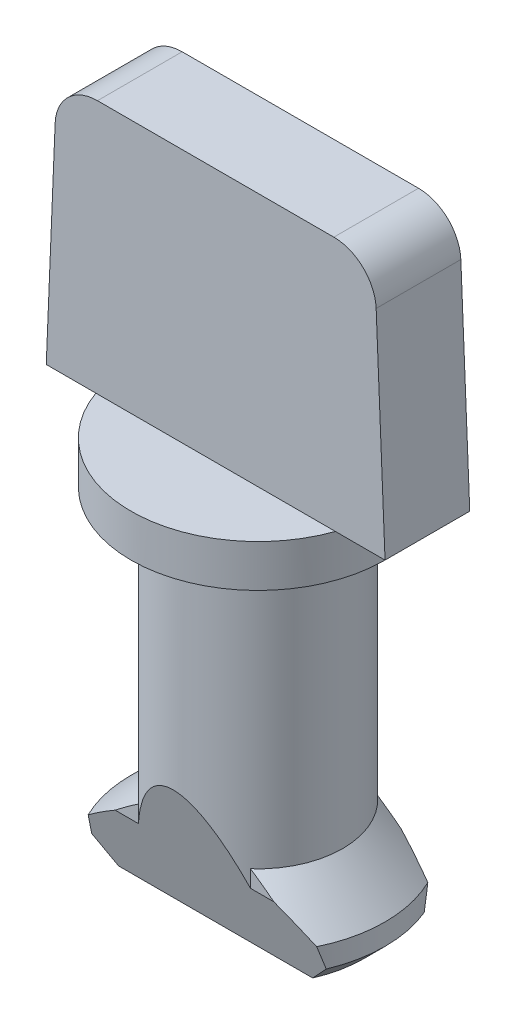
ISO-10303-21;
HEADER;
FILE_DESCRIPTION(('STEP AP214'),'2;1');
FILE_NAME('part.step','',(''),(''),'','','');
FILE_SCHEMA(('AUTOMOTIVE_DESIGN { 1 0 10303 214 1 1 1 1 }'));
ENDSEC;
DATA;
#1=APPLICATION_CONTEXT('core data for automotive mechanical design processes');
#2=APPLICATION_PROTOCOL_DEFINITION('international standard','automotive_design',2000,#1);
#3=PRODUCT_CONTEXT('',#1,'mechanical');
#4=PRODUCT('Part','Part','',(#3));
#5=PRODUCT_RELATED_PRODUCT_CATEGORY('part','',(#4));
#6=PRODUCT_DEFINITION_FORMATION('','',#4);
#7=PRODUCT_DEFINITION_CONTEXT('part definition',#1,'design');
#8=PRODUCT_DEFINITION('design','',#6,#7);
#9=PRODUCT_DEFINITION_SHAPE('','',#8);
#10=(LENGTH_UNIT() NAMED_UNIT(*) SI_UNIT(.MILLI.,.METRE.));
#11=(NAMED_UNIT(*) PLANE_ANGLE_UNIT() SI_UNIT($,.RADIAN.));
#12=(NAMED_UNIT(*) SI_UNIT($,.STERADIAN.) SOLID_ANGLE_UNIT());
#13=UNCERTAINTY_MEASURE_WITH_UNIT(LENGTH_MEASURE(1.E-05),#10,'distance_accuracy_value','');
#14=(GEOMETRIC_REPRESENTATION_CONTEXT(3) GLOBAL_UNCERTAINTY_ASSIGNED_CONTEXT((#13)) GLOBAL_UNIT_ASSIGNED_CONTEXT((#10,
#11,#12)) REPRESENTATION_CONTEXT('',''));
#15=CARTESIAN_POINT('',(0.,0.,0.));
#16=DIRECTION('',(0.,0.,1.));
#17=DIRECTION('',(1.,0.,0.));
#18=AXIS2_PLACEMENT_3D('',#15,#16,#17);
#19=CARTESIAN_POINT('',(0.,-8.4,0.));
#20=DIRECTION('',(0.,1.,0.));
#21=DIRECTION('',(0.,0.,1.));
#22=AXIS2_PLACEMENT_3D('',#19,#20,#21);
#23=CYLINDRICAL_SURFACE('',#22,2.);
#24=CARTESIAN_POINT('',(0.,0.,0.));
#25=DIRECTION('',(0.,1.,0.));
#26=DIRECTION('',(0.,0.,1.));
#27=AXIS2_PLACEMENT_3D('',#24,#25,#26);
#28=CIRCLE('',#27,2.);
#29=CARTESIAN_POINT('',(0.,0.,2.));
#30=VERTEX_POINT('',#29);
#31=EDGE_CURVE('E441',#30,#30,#28,.F.);
#32=ORIENTED_EDGE('',*,*,#31,.T.);
#33=EDGE_LOOP('',(#32));
#34=FACE_BOUND('',#33,.T.);
#35=CARTESIAN_POINT('',(0.,-11.6,0.));
#36=DIRECTION('',(0.,-0.298274993135947,-0.95447997803503));
#37=DIRECTION('',(0.,0.95447997803503,-0.298274993135947));
#38=AXIS2_PLACEMENT_3D('',#35,#36,#37);
#39=ELLIPSE('',#38,6.70522184569609,2.);
#40=CARTESIAN_POINT('',(1.32287565553229,-6.8,-1.5));
#41=VERTEX_POINT('',#40);
#42=CARTESIAN_POINT('',(-1.32287565553229,-6.8,-1.5));
#43=VERTEX_POINT('',#42);
#44=EDGE_CURVE('E54',#41,#43,#39,.F.);
#45=ORIENTED_EDGE('',*,*,#44,.T.);
#46=DIRECTION('',(0.,1.,0.));
#47=VECTOR('',#46,1.);
#48=CARTESIAN_POINT('',(-1.32287565553229,-8.4,-1.5));
#49=LINE('',#48,#47);
#50=CARTESIAN_POINT('',(-1.32287565553229,-6.4,-1.5));
#51=VERTEX_POINT('',#50);
#52=EDGE_CURVE('E372',#43,#51,#49,.T.);
#53=ORIENTED_EDGE('',*,*,#52,.T.);
#54=CARTESIAN_POINT('',(0.,-6.4,0.));
#55=DIRECTION('',(0.,-1.,0.));
#56=DIRECTION('',(0.,0.,-1.));
#57=AXIS2_PLACEMENT_3D('',#54,#55,#56);
#58=CIRCLE('',#57,2.);
#59=CARTESIAN_POINT('',(-1.3228756555323,-6.4,1.5));
#60=VERTEX_POINT('',#59);
#61=EDGE_CURVE('E206',#60,#51,#58,.T.);
#62=ORIENTED_EDGE('',*,*,#61,.F.);
#63=DIRECTION('',(0.,1.,0.));
#64=VECTOR('',#63,1.);
#65=CARTESIAN_POINT('',(-1.3228756555323,-8.4,1.5));
#66=LINE('',#65,#64);
#67=CARTESIAN_POINT('',(-1.3228756555323,-6.8,1.5));
#68=VERTEX_POINT('',#67);
#69=EDGE_CURVE('E374',#60,#68,#66,.F.);
#70=ORIENTED_EDGE('',*,*,#69,.T.);
#71=CARTESIAN_POINT('',(0.,-11.6,0.));
#72=DIRECTION('',(0.,-0.298274993135947,0.95447997803503));
#73=DIRECTION('',(0.,0.95447997803503,0.298274993135947));
#74=AXIS2_PLACEMENT_3D('',#71,#72,#73);
#75=ELLIPSE('',#74,6.70522184569609,2.);
#76=CARTESIAN_POINT('',(1.3228756555323,-6.8,1.5));
#77=VERTEX_POINT('',#76);
#78=EDGE_CURVE('E447',#68,#77,#75,.F.);
#79=ORIENTED_EDGE('',*,*,#78,.T.);
#80=DIRECTION('',(0.,1.,0.));
#81=VECTOR('',#80,1.);
#82=CARTESIAN_POINT('',(1.3228756555323,-8.4,1.5));
#83=LINE('',#82,#81);
#84=CARTESIAN_POINT('',(1.3228756555323,-6.4,1.5));
#85=VERTEX_POINT('',#84);
#86=EDGE_CURVE('E377',#77,#85,#83,.T.);
#87=ORIENTED_EDGE('',*,*,#86,.T.);
#88=CARTESIAN_POINT('',(1.32287565553229,-6.4,-1.5));
#89=VERTEX_POINT('',#88);
#90=EDGE_CURVE('E201',#89,#85,#58,.T.);
#91=ORIENTED_EDGE('',*,*,#90,.F.);
#92=DIRECTION('',(0.,1.,0.));
#93=VECTOR('',#92,1.);
#94=CARTESIAN_POINT('',(1.32287565553229,-8.4,-1.5));
#95=LINE('',#94,#93);
#96=EDGE_CURVE('E318',#89,#41,#95,.F.);
#97=ORIENTED_EDGE('',*,*,#96,.T.);
#98=EDGE_LOOP('',(#45,#53,#62,#70,#79,#87,#91,#97));
#99=FACE_BOUND('',#98,.T.);
#100=ADVANCED_FACE('F34',(#34,#99),#23,.T.);
#101=CARTESIAN_POINT('',(0.,-8.4,0.));
#102=DIRECTION('',(0.,-1.,0.));
#103=DIRECTION('',(0.,0.,-1.));
#104=AXIS2_PLACEMENT_3D('',#101,#102,#103);
#105=PLANE('',#104);
#106=CARTESIAN_POINT('',(0.,-8.4,0.));
#107=DIRECTION('',(0.,-1.,0.));
#108=DIRECTION('',(0.,0.,-1.));
#109=AXIS2_PLACEMENT_3D('',#106,#107,#108);
#110=CIRCLE('',#109,2.5);
#111=CARTESIAN_POINT('',(-2.29128784747792,-8.4,1.));
#112=VERTEX_POINT('',#111);
#113=CARTESIAN_POINT('',(-2.29128784747792,-8.4,-1.));
#114=VERTEX_POINT('',#113);
#115=EDGE_CURVE('E192',#112,#114,#110,.T.);
#116=ORIENTED_EDGE('',*,*,#115,.T.);
#117=DIRECTION('',(-1.,0.,0.));
#118=VECTOR('',#117,1.);
#119=CARTESIAN_POINT('',(4.001,-8.4,-1.));
#120=LINE('',#119,#118);
#121=CARTESIAN_POINT('',(2.29128784747792,-8.4,-1.));
#122=VERTEX_POINT('',#121);
#123=EDGE_CURVE('E174',#122,#114,#120,.T.);
#124=ORIENTED_EDGE('',*,*,#123,.F.);
#125=CARTESIAN_POINT('',(0.,-8.4,0.));
#126=DIRECTION('',(0.,-1.,0.));
#127=DIRECTION('',(0.,0.,-1.));
#128=AXIS2_PLACEMENT_3D('',#125,#126,#127);
#129=CIRCLE('',#128,2.5);
#130=CARTESIAN_POINT('',(2.29128784747792,-8.4,1.));
#131=VERTEX_POINT('',#130);
#132=EDGE_CURVE('E200',#122,#131,#129,.T.);
#133=ORIENTED_EDGE('',*,*,#132,.T.);
#134=DIRECTION('',(-1.,0.,0.));
#135=VECTOR('',#134,1.);
#136=CARTESIAN_POINT('',(4.001,-8.4,1.));
#137=LINE('',#136,#135);
#138=EDGE_CURVE('E199',#131,#112,#137,.T.);
#139=ORIENTED_EDGE('',*,*,#138,.T.);
#140=EDGE_LOOP('',(#116,#124,#133,#139));
#141=FACE_BOUND('',#140,.T.);
#142=ADVANCED_FACE('F197',(#141),#105,.T.);
#143=CARTESIAN_POINT('',(0.,-6.4,0.));
#144=DIRECTION('',(0.,-1.,0.));
#145=DIRECTION('',(0.,0.,-1.));
#146=AXIS2_PLACEMENT_3D('',#143,#144,#145);
#147=CYLINDRICAL_SURFACE('',#146,3.);
#148=CARTESIAN_POINT('',(0.,-7.40000000000001,0.));
#149=DIRECTION('',(0.,-1.,0.));
#150=DIRECTION('',(0.,0.,-1.));
#151=AXIS2_PLACEMENT_3D('',#148,#149,#150);
#152=CIRCLE('',#151,3.);
#153=CARTESIAN_POINT('',(-2.6976552318634,-7.40000000000001,1.3125));
#154=VERTEX_POINT('',#153);
#155=CARTESIAN_POINT('',(-2.6976552318634,-7.40000000000001,-1.3125));
#156=VERTEX_POINT('',#155);
#157=EDGE_CURVE('E310',#154,#156,#152,.T.);
#158=ORIENTED_EDGE('',*,*,#157,.T.);
#159=CARTESIAN_POINT('',(0.,-11.6,0.));
#160=DIRECTION('',(0.,0.298274993135947,0.95447997803503));
#161=DIRECTION('',(0.,-0.95447997803503,0.298274993135947));
#162=AXIS2_PLACEMENT_3D('',#159,#160,#161);
#163=ELLIPSE('',#162,10.0578327685441,3.);
#164=CARTESIAN_POINT('',(-2.76822794175263,-7.9,-1.15625));
#165=VERTEX_POINT('',#164);
#166=EDGE_CURVE('E194',#156,#165,#163,.T.);
#167=ORIENTED_EDGE('',*,*,#166,.T.);
#168=CARTESIAN_POINT('',(0.,-7.9,0.));
#169=DIRECTION('',(0.,-1.,0.));
#170=DIRECTION('',(0.,0.,-1.));
#171=AXIS2_PLACEMENT_3D('',#168,#169,#170);
#172=CIRCLE('',#171,3.);
#173=CARTESIAN_POINT('',(-2.76822794175263,-7.9,1.15625));
#174=VERTEX_POINT('',#173);
#175=EDGE_CURVE('E193',#165,#174,#172,.F.);
#176=ORIENTED_EDGE('',*,*,#175,.T.);
#177=CARTESIAN_POINT('',(0.,-11.6,0.));
#178=DIRECTION('',(0.,0.298274993135947,-0.95447997803503));
#179=DIRECTION('',(0.,-0.95447997803503,-0.298274993135947));
#180=AXIS2_PLACEMENT_3D('',#177,#178,#179);
#181=ELLIPSE('',#180,10.0578327685441,3.);
#182=EDGE_CURVE('E474',#174,#154,#181,.T.);
#183=ORIENTED_EDGE('',*,*,#182,.T.);
#184=EDGE_LOOP('',(#158,#167,#176,#183));
#185=FACE_BOUND('',#184,.T.);
#186=ADVANCED_FACE('F297',(#185),#147,.T.);
#187=CARTESIAN_POINT('',(0.,-6.4,0.));
#188=DIRECTION('',(0.,-1.,0.));
#189=DIRECTION('',(0.,0.,-1.));
#190=AXIS2_PLACEMENT_3D('',#187,#188,#189);
#191=CYLINDRICAL_SURFACE('',#190,3.);
#192=CARTESIAN_POINT('',(0.,-7.9,0.));
#193=DIRECTION('',(0.,-1.,0.));
#194=DIRECTION('',(0.,0.,-1.));
#195=AXIS2_PLACEMENT_3D('',#192,#193,#194);
#196=CIRCLE('',#195,3.);
#197=CARTESIAN_POINT('',(2.76822794175263,-7.9,1.15625));
#198=VERTEX_POINT('',#197);
#199=CARTESIAN_POINT('',(2.76822794175263,-7.9,-1.15625));
#200=VERTEX_POINT('',#199);
#201=EDGE_CURVE('E203',#198,#200,#196,.F.);
#202=ORIENTED_EDGE('',*,*,#201,.T.);
#203=CARTESIAN_POINT('',(0.,-11.6,0.));
#204=DIRECTION('',(0.,-0.298274993135947,-0.95447997803503));
#205=DIRECTION('',(0.,-0.95447997803503,0.298274993135947));
#206=AXIS2_PLACEMENT_3D('',#203,#204,#205);
#207=ELLIPSE('',#206,10.0578327685441,3.);
#208=CARTESIAN_POINT('',(2.6976552318634,-7.40000000000001,-1.3125));
#209=VERTEX_POINT('',#208);
#210=EDGE_CURVE('E325',#209,#200,#207,.T.);
#211=ORIENTED_EDGE('',*,*,#210,.F.);
#212=CARTESIAN_POINT('',(0.,-7.40000000000001,0.));
#213=DIRECTION('',(0.,-1.,0.));
#214=DIRECTION('',(0.,0.,-1.));
#215=AXIS2_PLACEMENT_3D('',#212,#213,#214);
#216=CIRCLE('',#215,3.);
#217=CARTESIAN_POINT('',(2.6976552318634,-7.40000000000001,1.3125));
#218=VERTEX_POINT('',#217);
#219=EDGE_CURVE('E213',#209,#218,#216,.T.);
#220=ORIENTED_EDGE('',*,*,#219,.T.);
#221=CARTESIAN_POINT('',(0.,-11.6,0.));
#222=DIRECTION('',(0.,-0.298274993135947,0.95447997803503));
#223=DIRECTION('',(0.,-0.95447997803503,-0.298274993135947));
#224=AXIS2_PLACEMENT_3D('',#221,#222,#223);
#225=ELLIPSE('',#224,10.0578327685441,3.);
#226=EDGE_CURVE('E379',#198,#218,#225,.T.);
#227=ORIENTED_EDGE('',*,*,#226,.F.);
#228=EDGE_LOOP('',(#202,#211,#220,#227));
#229=FACE_BOUND('',#228,.T.);
#230=ADVANCED_FACE('F242',(#229),#191,.T.);
#231=CARTESIAN_POINT('',(0.,-8.4,0.));
#232=DIRECTION('',(0.,1.,0.));
#233=DIRECTION('',(0.,0.,1.));
#234=AXIS2_PLACEMENT_3D('',#231,#232,#233);
#235=CONICAL_SURFACE('',#234,2.5,0.785398163397445);
#236=ORIENTED_EDGE('',*,*,#132,.F.);
#237=CARTESIAN_POINT('',(2.76841858149084,-7.8998,-1.1563125));
#238=CARTESIAN_POINT('',(2.68889899167645,-7.98322956567684,-1.13024076072599));
#239=CARTESIAN_POINT('',(2.60936239067763,-8.0666443483715,-1.10417364113391));
#240=CARTESIAN_POINT('',(2.45025516576241,-8.23344434837168,-1.05204864113385));
#241=CARTESIAN_POINT('',(2.37068454184578,-8.31682956567699,-1.02599076072594));
#242=CARTESIAN_POINT('',(2.29109690674448,-8.40019999999992,-0.999937500000026));
#243=B_SPLINE_CURVE_WITH_KNOTS('',3,(#237,#238,#239,#240,#241,#242),.UNSPECIFIED.,.F.,.F.,(4,2,
4),(0.,0.354502925726211,0.709005853897474),.UNSPECIFIED.);
#244=EDGE_CURVE('E180',#200,#122,#243,.T.);
#245=ORIENTED_EDGE('',*,*,#244,.F.);
#246=ORIENTED_EDGE('',*,*,#201,.F.);
#247=CARTESIAN_POINT('',(2.29109690674448,-8.40019999999992,0.999937500000026));
#248=CARTESIAN_POINT('',(2.37068454184578,-8.31682956567699,1.02599076072594));
#249=CARTESIAN_POINT('',(2.45025516576241,-8.23344434837168,1.05204864113385));
#250=CARTESIAN_POINT('',(2.60936239067763,-8.0666443483715,1.10417364113391));
#251=CARTESIAN_POINT('',(2.68889899167645,-7.98322956567684,1.13024076072599));
#252=CARTESIAN_POINT('',(2.76841858149084,-7.8998,1.1563125));
#253=B_SPLINE_CURVE_WITH_KNOTS('',3,(#247,#248,#249,#250,#251,#252),.UNSPECIFIED.,.F.,.F.,(4,2,
4),(0.,0.354502928171264,0.709005853897474),.UNSPECIFIED.);
#254=EDGE_CURVE('E468',#131,#198,#253,.T.);
#255=ORIENTED_EDGE('',*,*,#254,.F.);
#256=EDGE_LOOP('',(#236,#245,#246,#255));
#257=FACE_BOUND('',#256,.T.);
#258=ADVANCED_FACE('F239',(#257),#235,.T.);
#259=CARTESIAN_POINT('',(0.,-8.4,0.));
#260=DIRECTION('',(0.,1.,0.));
#261=DIRECTION('',(0.,0.,1.));
#262=AXIS2_PLACEMENT_3D('',#259,#260,#261);
#263=CONICAL_SURFACE('',#262,2.5,0.785398163397445);
#264=ORIENTED_EDGE('',*,*,#175,.F.);
#265=CARTESIAN_POINT('',(-2.76841858149084,-7.8998,-1.1563125));
#266=CARTESIAN_POINT('',(-2.68889899167644,-7.98322956567685,-1.13024076072598));
#267=CARTESIAN_POINT('',(-2.6093623906776,-8.06664434837153,-1.1041736411339));
#268=CARTESIAN_POINT('',(-2.45025516576236,-8.23344434837173,-1.05204864113383));
#269=CARTESIAN_POINT('',(-2.37068454184571,-8.31682956567706,-1.02599076072592));
#270=CARTESIAN_POINT('',(-2.2910969067444,-8.4002,-0.9999375));
#271=B_SPLINE_CURVE_WITH_KNOTS('',3,(#265,#266,#267,#268,#269,#270),.UNSPECIFIED.,.F.,.F.,(4,2,
4),(0.,0.354502925726269,0.709005853897592),.UNSPECIFIED.);
#272=EDGE_CURVE('E177',#165,#114,#271,.T.);
#273=ORIENTED_EDGE('',*,*,#272,.T.);
#274=ORIENTED_EDGE('',*,*,#115,.F.);
#275=CARTESIAN_POINT('',(-2.2910969067444,-8.4002,0.9999375));
#276=CARTESIAN_POINT('',(-2.37068454184571,-8.31682956567706,1.02599076072592));
#277=CARTESIAN_POINT('',(-2.45025516576236,-8.23344434837173,1.05204864113383));
#278=CARTESIAN_POINT('',(-2.6093623906776,-8.06664434837153,1.1041736411339));
#279=CARTESIAN_POINT('',(-2.68889899167644,-7.98322956567685,1.13024076072598));
#280=CARTESIAN_POINT('',(-2.76841858149084,-7.8998,1.1563125));
#281=B_SPLINE_CURVE_WITH_KNOTS('',3,(#275,#276,#277,#278,#279,#280),.UNSPECIFIED.,.F.,.F.,(4,2,
4),(0.,0.354502928171324,0.709005853897592),.UNSPECIFIED.);
#282=EDGE_CURVE('E327',#112,#174,#281,.T.);
#283=ORIENTED_EDGE('',*,*,#282,.T.);
#284=EDGE_LOOP('',(#264,#273,#274,#283));
#285=FACE_BOUND('',#284,.T.);
#286=ADVANCED_FACE('F190',(#285),#263,.T.);
#287=CARTESIAN_POINT('',(0.,-7.40000000000001,0.));
#288=DIRECTION('',(0.,-1.,0.));
#289=DIRECTION('',(0.,0.,-1.));
#290=AXIS2_PLACEMENT_3D('',#287,#288,#289);
#291=CONICAL_SURFACE('',#290,3.,0.78539816339745);
#292=ORIENTED_EDGE('',*,*,#219,.F.);
#293=CARTESIAN_POINT('',(1.87251925747105,-6.79936,-1.5002));
#294=CARTESIAN_POINT('',(1.94396375249612,-6.84602449107282,-1.48561734653975));
#295=CARTESIAN_POINT('',(2.01461624770995,-6.89377203946956,-1.47069623766576));
#296=CARTESIAN_POINT('',(2.15450474216702,-6.99105296639402,-1.44029594800187));
#297=CARTESIAN_POINT('',(2.22374145857821,-7.04058540379669,-1.42481706131354));
#298=CARTESIAN_POINT('',(2.36102860329289,-7.14109691534921,-1.39340721395337));
#299=CARTESIAN_POINT('',(2.42907922230267,-7.19207575341083,-1.37747632705912));
#300=CARTESIAN_POINT('',(2.56419932059313,-7.29527370373339,-1.34522696758332));
#301=CARTESIAN_POINT('',(2.63126827296004,-7.34749344525601,-1.3289082983575));
#302=CARTESIAN_POINT('',(2.69790805043347,-7.40020000000001,-1.3124375));
#303=B_SPLINE_CURVE_WITH_KNOTS('',3,(#293,#294,#295,#296,#297,#298,#299,#300,#301,#302),
.UNSPECIFIED.,.F.,.F.,(4,2,2,2,4),(0.,0.259683704644583,0.519232432836738,0.778739037272773,
1.03838017070004),.UNSPECIFIED.);
#304=CARTESIAN_POINT('',(1.87349939951959,-6.80000000000005,-1.49999999999998));
#305=VERTEX_POINT('',#304);
#306=EDGE_CURVE('E184',#305,#209,#303,.T.);
#307=ORIENTED_EDGE('',*,*,#306,.F.);
#308=CARTESIAN_POINT('',(1.32287565553228,-6.4,-1.5));
#309=CARTESIAN_POINT('',(1.37927780634971,-6.43733009722094,-1.5));
#310=CARTESIAN_POINT('',(1.4350746037007,-6.4755544852038,-1.5));
#311=CARTESIAN_POINT('',(1.54562391618774,-6.55346001850828,-1.5));
#312=CARTESIAN_POINT('',(1.60037667643987,-6.59314081533693,-1.5));
#313=CARTESIAN_POINT('',(1.70898069254342,-6.67360813443487,-1.5));
#314=CARTESIAN_POINT('',(1.76283273605452,-6.71439359904855,-1.5));
#315=CARTESIAN_POINT('',(1.86982608787185,-6.79689180204332,-1.5));
#316=CARTESIAN_POINT('',(1.92296734799838,-6.83860460277784,-1.5));
#317=CARTESIAN_POINT('',(2.081432912337,-6.96481248213767,-1.5));
#318=CARTESIAN_POINT('',(2.18586566547732,-7.05042711859945,-1.5));
#319=CARTESIAN_POINT('',(2.3412699999935,-7.18042270232268,-1.5));
#320=CARTESIAN_POINT('',(2.39288833200145,-7.22403804046788,-1.5));
#321=CARTESIAN_POINT('',(2.49574934324268,-7.31170762331325,-1.5));
#322=CARTESIAN_POINT('',(2.54699202981894,-7.35576185939409,-1.5));
#323=CARTESIAN_POINT('',(2.59807621135332,-7.40000000000001,-1.5));
#324=B_SPLINE_CURVE_WITH_KNOTS('',3,(#308,#309,#310,#311,#312,#313,#314,#315,#316,#317,#318,
#319,#320,#321,#322,#323),.UNSPECIFIED.,.F.,.F.,(4,2,2,2,2,2,2,4),(0.,0.202885634193625,
0.40572303394259,0.608372652959489,0.811035939454979,1.21611247425471,1.41884446761483,
1.6215724874218),.UNSPECIFIED.);
#325=EDGE_CURVE('E221',#89,#305,#324,.T.);
#326=ORIENTED_EDGE('',*,*,#325,.F.);
#327=ORIENTED_EDGE('',*,*,#90,.T.);
#328=CARTESIAN_POINT('',(2.59807621135331,-7.40000000000001,1.5));
#329=CARTESIAN_POINT('',(2.54699202981894,-7.35576185939409,1.5));
#330=CARTESIAN_POINT('',(2.49574934324268,-7.31170762331325,1.5));
#331=CARTESIAN_POINT('',(2.39288833200145,-7.22403804046788,1.5));
#332=CARTESIAN_POINT('',(2.3412699999935,-7.18042270232268,1.5));
#333=CARTESIAN_POINT('',(2.18586566547732,-7.05042711859945,1.5));
#334=CARTESIAN_POINT('',(2.081432912337,-6.96481248213767,1.5));
#335=CARTESIAN_POINT('',(1.92296734799838,-6.83860460277784,1.5));
#336=CARTESIAN_POINT('',(1.86982608787185,-6.79689180204332,1.5));
#337=CARTESIAN_POINT('',(1.76283273605452,-6.71439359904855,1.5));
#338=CARTESIAN_POINT('',(1.70898069254342,-6.67360813443487,1.5));
#339=CARTESIAN_POINT('',(1.60037667643987,-6.59314081533693,1.5));
#340=CARTESIAN_POINT('',(1.54562391618774,-6.55346001850828,1.5));
#341=CARTESIAN_POINT('',(1.4350746037007,-6.4755544852038,1.5));
#342=CARTESIAN_POINT('',(1.37927780634971,-6.43733009722094,1.5));
#343=CARTESIAN_POINT('',(1.32287565553228,-6.4,1.5));
#344=B_SPLINE_CURVE_WITH_KNOTS('',3,(#328,#329,#330,#331,#332,#333,#334,#335,#336,#337,#338,
#339,#340,#341,#342,#343),.UNSPECIFIED.,.F.,.F.,(4,2,2,2,2,2,2,4),(0.,0.202728019806967,
0.405460013167094,0.810536547966824,1.01319983446231,1.21584945347921,1.41868685322818,
1.6215724874218),.UNSPECIFIED.);
#345=CARTESIAN_POINT('',(1.87349939954518,-6.80000000001676,1.49999999999476));
#346=VERTEX_POINT('',#345);
#347=EDGE_CURVE('E215',#346,#85,#344,.T.);
#348=ORIENTED_EDGE('',*,*,#347,.F.);
#349=CARTESIAN_POINT('',(2.69790805043347,-7.40020000000001,1.3124375));
#350=CARTESIAN_POINT('',(2.63126827296004,-7.347493445256,1.3289082983575));
#351=CARTESIAN_POINT('',(2.56419932059313,-7.29527370373339,1.34522696758332));
#352=CARTESIAN_POINT('',(2.42907922230267,-7.19207575341083,1.37747632705912));
#353=CARTESIAN_POINT('',(2.36102860329289,-7.14109691534921,1.39340721395337));
#354=CARTESIAN_POINT('',(2.22374145857821,-7.04058540379669,1.42481706131353));
#355=CARTESIAN_POINT('',(2.15450474216703,-6.99105296639403,1.44029594800187));
#356=CARTESIAN_POINT('',(2.01461624770996,-6.89377203946956,1.47069623766576));
#357=CARTESIAN_POINT('',(1.94396375249612,-6.84602449107282,1.48561734653974));
#358=CARTESIAN_POINT('',(1.87251925747106,-6.79936,1.5002));
#359=B_SPLINE_CURVE_WITH_KNOTS('',3,(#349,#350,#351,#352,#353,#354,#355,#356,#357,#358),
.UNSPECIFIED.,.F.,.F.,(4,2,2,2,4),(0.,0.259641133427271,0.519147737863305,0.778696466055458,
1.03838017070004),.UNSPECIFIED.);
#360=EDGE_CURVE('E451',#218,#346,#359,.T.);
#361=ORIENTED_EDGE('',*,*,#360,.F.);
#362=EDGE_LOOP('',(#292,#307,#326,#327,#348,#361));
#363=FACE_BOUND('',#362,.T.);
#364=ADVANCED_FACE('F231',(#363),#291,.T.);
#365=CARTESIAN_POINT('',(0.,-7.40000000000001,0.));
#366=DIRECTION('',(0.,-1.,0.));
#367=DIRECTION('',(0.,0.,-1.));
#368=AXIS2_PLACEMENT_3D('',#365,#366,#367);
#369=CONICAL_SURFACE('',#368,3.,0.78539816339745);
#370=CARTESIAN_POINT('',(-2.59807621135331,-7.40000000000001,-1.5));
#371=CARTESIAN_POINT('',(-2.54699202981894,-7.35576185939409,-1.5));
#372=CARTESIAN_POINT('',(-2.49574934324268,-7.31170762331325,-1.5));
#373=CARTESIAN_POINT('',(-2.39288833200145,-7.22403804046788,-1.5));
#374=CARTESIAN_POINT('',(-2.3412699999935,-7.18042270232268,-1.5));
#375=CARTESIAN_POINT('',(-2.18586566547732,-7.05042711859945,-1.5));
#376=CARTESIAN_POINT('',(-2.081432912337,-6.96481248213767,-1.5));
#377=CARTESIAN_POINT('',(-1.92296734799838,-6.83860460277784,-1.5));
#378=CARTESIAN_POINT('',(-1.86982608787185,-6.79689180204332,-1.5));
#379=CARTESIAN_POINT('',(-1.76283273605452,-6.71439359904855,-1.5));
#380=CARTESIAN_POINT('',(-1.70898069254342,-6.67360813443487,-1.5));
#381=CARTESIAN_POINT('',(-1.60037667643987,-6.59314081533693,-1.5));
#382=CARTESIAN_POINT('',(-1.54562391618774,-6.55346001850828,-1.5));
#383=CARTESIAN_POINT('',(-1.4350746037007,-6.4755544852038,-1.5));
#384=CARTESIAN_POINT('',(-1.37927780634971,-6.43733009722094,-1.5));
#385=CARTESIAN_POINT('',(-1.32287565553228,-6.4,-1.5));
#386=B_SPLINE_CURVE_WITH_KNOTS('',3,(#370,#371,#372,#373,#374,#375,#376,#377,#378,#379,#380,
#381,#382,#383,#384,#385),.UNSPECIFIED.,.F.,.F.,(4,2,2,2,2,2,2,4),(0.,0.202728019806967,
0.405460013167094,0.810536547966824,1.01319983446231,1.21584945347921,1.41868685322818,
1.6215724874218),.UNSPECIFIED.);
#387=CARTESIAN_POINT('',(-1.87349939951958,-6.80000000000006,-1.5));
#388=VERTEX_POINT('',#387);
#389=EDGE_CURVE('E47',#388,#51,#386,.T.);
#390=ORIENTED_EDGE('',*,*,#389,.F.);
#391=CARTESIAN_POINT('',(-1.87251925747105,-6.79936,-1.5002));
#392=CARTESIAN_POINT('',(-1.94396375249612,-6.84602449107282,-1.48561734653975));
#393=CARTESIAN_POINT('',(-2.01461624770995,-6.89377203946956,-1.47069623766576));
#394=CARTESIAN_POINT('',(-2.15450474216702,-6.99105296639402,-1.44029594800187));
#395=CARTESIAN_POINT('',(-2.22374145857821,-7.04058540379669,-1.42481706131354));
#396=CARTESIAN_POINT('',(-2.36102860329289,-7.14109691534921,-1.39340721395337));
#397=CARTESIAN_POINT('',(-2.42907922230267,-7.19207575341083,-1.37747632705912));
#398=CARTESIAN_POINT('',(-2.56419932059313,-7.29527370373338,-1.34522696758332));
#399=CARTESIAN_POINT('',(-2.63126827296004,-7.347493445256,-1.3289082983575));
#400=CARTESIAN_POINT('',(-2.69790805043347,-7.40020000000001,-1.3124375));
#401=B_SPLINE_CURVE_WITH_KNOTS('',3,(#391,#392,#393,#394,#395,#396,#397,#398,#399,#400),
.UNSPECIFIED.,.F.,.F.,(4,2,2,2,4),(0.,0.259683704644583,0.519232432836738,0.778739037272772,
1.03838017070004),.UNSPECIFIED.);
#402=EDGE_CURVE('E358',#388,#156,#401,.T.);
#403=ORIENTED_EDGE('',*,*,#402,.T.);
#404=ORIENTED_EDGE('',*,*,#157,.F.);
#405=CARTESIAN_POINT('',(-2.69790805043347,-7.40020000000001,1.3124375));
#406=CARTESIAN_POINT('',(-2.63126827296004,-7.347493445256,1.3289082983575));
#407=CARTESIAN_POINT('',(-2.56419932059313,-7.29527370373339,1.34522696758332));
#408=CARTESIAN_POINT('',(-2.42907922230267,-7.19207575341083,1.37747632705912));
#409=CARTESIAN_POINT('',(-2.3610286032929,-7.14109691534921,1.39340721395337));
#410=CARTESIAN_POINT('',(-2.22374145857822,-7.04058540379669,1.42481706131353));
#411=CARTESIAN_POINT('',(-2.15450474216703,-6.99105296639403,1.44029594800187));
#412=CARTESIAN_POINT('',(-2.01461624770996,-6.89377203946956,1.47069623766576));
#413=CARTESIAN_POINT('',(-1.94396375249613,-6.84602449107282,1.48561734653974));
#414=CARTESIAN_POINT('',(-1.87251925747106,-6.79936,1.5002));
#415=B_SPLINE_CURVE_WITH_KNOTS('',3,(#405,#406,#407,#408,#409,#410,#411,#412,#413,#414),
.UNSPECIFIED.,.F.,.F.,(4,2,2,2,4),(0.,0.25964113342727,0.519147737863302,0.778696466055454,
1.03838017070003),.UNSPECIFIED.);
#416=CARTESIAN_POINT('',(-1.87349939951951,-6.8,1.5));
#417=VERTEX_POINT('',#416);
#418=EDGE_CURVE('E476',#154,#417,#415,.T.);
#419=ORIENTED_EDGE('',*,*,#418,.T.);
#420=CARTESIAN_POINT('',(-1.32287565553228,-6.4,1.5));
#421=CARTESIAN_POINT('',(-1.37927780634971,-6.43733009722094,1.5));
#422=CARTESIAN_POINT('',(-1.4350746037007,-6.4755544852038,1.5));
#423=CARTESIAN_POINT('',(-1.54562391618774,-6.55346001850828,1.5));
#424=CARTESIAN_POINT('',(-1.60037667643987,-6.59314081533693,1.5));
#425=CARTESIAN_POINT('',(-1.70898069254342,-6.67360813443487,1.5));
#426=CARTESIAN_POINT('',(-1.76283273605452,-6.71439359904855,1.5));
#427=CARTESIAN_POINT('',(-1.86982608787185,-6.79689180204332,1.5));
#428=CARTESIAN_POINT('',(-1.92296734799838,-6.83860460277784,1.5));
#429=CARTESIAN_POINT('',(-2.081432912337,-6.96481248213767,1.5));
#430=CARTESIAN_POINT('',(-2.18586566547732,-7.05042711859945,1.5));
#431=CARTESIAN_POINT('',(-2.3412699999935,-7.18042270232268,1.5));
#432=CARTESIAN_POINT('',(-2.39288833200145,-7.22403804046788,1.5));
#433=CARTESIAN_POINT('',(-2.49574934324268,-7.31170762331325,1.5));
#434=CARTESIAN_POINT('',(-2.54699202981894,-7.35576185939409,1.5));
#435=CARTESIAN_POINT('',(-2.59807621135332,-7.40000000000001,1.5));
#436=B_SPLINE_CURVE_WITH_KNOTS('',3,(#420,#421,#422,#423,#424,#425,#426,#427,#428,#429,#430,
#431,#432,#433,#434,#435),.UNSPECIFIED.,.F.,.F.,(4,2,2,2,2,2,2,4),(0.,0.202885634193625,
0.40572303394259,0.608372652959489,0.811035939454979,1.21611247425471,1.41884446761484,
1.6215724874218),.UNSPECIFIED.);
#437=EDGE_CURVE('E11',#60,#417,#436,.T.);
#438=ORIENTED_EDGE('',*,*,#437,.F.);
#439=ORIENTED_EDGE('',*,*,#61,.T.);
#440=EDGE_LOOP('',(#390,#403,#404,#419,#438,#439));
#441=FACE_BOUND('',#440,.T.);
#442=ADVANCED_FACE('F36',(#441),#369,.T.);
#443=CARTESIAN_POINT('',(-2.59807621135331,-6.4,-1.5));
#444=DIRECTION('',(0.,0.,-1.));
#445=DIRECTION('',(-1.,0.,0.));
#446=AXIS2_PLACEMENT_3D('',#443,#444,#445);
#447=PLANE('',#446);
#448=ORIENTED_EDGE('',*,*,#52,.F.);
#449=DIRECTION('',(-1.,0.,0.));
#450=VECTOR('',#449,1.);
#451=CARTESIAN_POINT('',(-4.001,-6.8,-1.5));
#452=LINE('',#451,#450);
#453=EDGE_CURVE('E363',#43,#388,#452,.T.);
#454=ORIENTED_EDGE('',*,*,#453,.T.);
#455=ORIENTED_EDGE('',*,*,#389,.T.);
#456=EDGE_LOOP('',(#448,#454,#455));
#457=FACE_BOUND('',#456,.T.);
#458=ADVANCED_FACE('F300',(#457),#447,.T.);
#459=ORIENTED_EDGE('',*,*,#325,.T.);
#460=DIRECTION('',(1.,0.,0.));
#461=VECTOR('',#460,1.);
#462=CARTESIAN_POINT('',(4.001,-6.8,-1.5));
#463=LINE('',#462,#461);
#464=EDGE_CURVE('E185',#41,#305,#463,.T.);
#465=ORIENTED_EDGE('',*,*,#464,.F.);
#466=ORIENTED_EDGE('',*,*,#96,.F.);
#467=EDGE_LOOP('',(#459,#465,#466));
#468=FACE_BOUND('',#467,.T.);
#469=ADVANCED_FACE('F303',(#468),#447,.T.);
#470=CARTESIAN_POINT('',(-2.59807621135332,-6.4,1.5));
#471=DIRECTION('',(0.,0.,1.));
#472=DIRECTION('',(1.,0.,0.));
#473=AXIS2_PLACEMENT_3D('',#470,#471,#472);
#474=PLANE('',#473);
#475=ORIENTED_EDGE('',*,*,#437,.T.);
#476=DIRECTION('',(1.,0.,0.));
#477=VECTOR('',#476,1.);
#478=CARTESIAN_POINT('',(-4.001,-6.8,1.5));
#479=LINE('',#478,#477);
#480=EDGE_CURVE('E62',#417,#68,#479,.T.);
#481=ORIENTED_EDGE('',*,*,#480,.T.);
#482=ORIENTED_EDGE('',*,*,#69,.F.);
#483=EDGE_LOOP('',(#475,#481,#482));
#484=FACE_BOUND('',#483,.T.);
#485=ADVANCED_FACE('F227',(#484),#474,.T.);
#486=ORIENTED_EDGE('',*,*,#86,.F.);
#487=DIRECTION('',(-1.,0.,0.));
#488=VECTOR('',#487,1.);
#489=CARTESIAN_POINT('',(4.001,-6.8,1.5));
#490=LINE('',#489,#488);
#491=EDGE_CURVE('E450',#346,#77,#490,.T.);
#492=ORIENTED_EDGE('',*,*,#491,.F.);
#493=ORIENTED_EDGE('',*,*,#347,.T.);
#494=EDGE_LOOP('',(#486,#492,#493));
#495=FACE_BOUND('',#494,.T.);
#496=ADVANCED_FACE('F263',(#495),#474,.T.);
#497=CARTESIAN_POINT('',(0.,0.,0.));
#498=DIRECTION('',(0.,1.,0.));
#499=DIRECTION('',(0.,0.,1.));
#500=AXIS2_PLACEMENT_3D('',#497,#498,#499);
#501=PLANE('',#500);
#502=CARTESIAN_POINT('',(0.,0.,0.));
#503=DIRECTION('',(0.,1.,0.));
#504=DIRECTION('',(0.,0.,1.));
#505=AXIS2_PLACEMENT_3D('',#502,#503,#504);
#506=CIRCLE('',#505,3.);
#507=CARTESIAN_POINT('',(0.,0.,3.));
#508=VERTEX_POINT('',#507);
#509=EDGE_CURVE('E414',#508,#508,#506,.T.);
#510=ORIENTED_EDGE('',*,*,#509,.F.);
#511=EDGE_LOOP('',(#510));
#512=FACE_BOUND('',#511,.T.);
#513=ORIENTED_EDGE('',*,*,#31,.F.);
#514=EDGE_LOOP('',(#513));
#515=FACE_BOUND('',#514,.T.);
#516=ADVANCED_FACE('F260',(#512,#515),#501,.F.);
#517=CARTESIAN_POINT('',(0.,1.,0.));
#518=DIRECTION('',(0.,1.,0.));
#519=DIRECTION('',(0.,0.,1.));
#520=AXIS2_PLACEMENT_3D('',#517,#518,#519);
#521=PLANE('',#520);
#522=CARTESIAN_POINT('',(0.,1.,0.));
#523=DIRECTION('',(0.,1.,0.));
#524=DIRECTION('',(0.,0.,1.));
#525=AXIS2_PLACEMENT_3D('',#522,#523,#524);
#526=CIRCLE('',#525,3.);
#527=CARTESIAN_POINT('',(2.82842712474619,1.,-1.));
#528=VERTEX_POINT('',#527);
#529=CARTESIAN_POINT('',(-2.82842712474619,1.,-1.));
#530=VERTEX_POINT('',#529);
#531=EDGE_CURVE('E420',#528,#530,#526,.T.);
#532=ORIENTED_EDGE('',*,*,#531,.T.);
#533=DIRECTION('',(1.,0.,0.));
#534=VECTOR('',#533,1.);
#535=CARTESIAN_POINT('',(-4.,1.,-1.));
#536=LINE('',#535,#534);
#537=EDGE_CURVE('E404',#530,#528,#536,.T.);
#538=ORIENTED_EDGE('',*,*,#537,.T.);
#539=EDGE_LOOP('',(#532,#538));
#540=FACE_BOUND('',#539,.T.);
#541=ADVANCED_FACE('F258',(#540),#521,.T.);
#542=CARTESIAN_POINT('',(0.,1.,0.));
#543=DIRECTION('',(0.,-1.,0.));
#544=DIRECTION('',(0.,0.,-1.));
#545=AXIS2_PLACEMENT_3D('',#542,#543,#544);
#546=CYLINDRICAL_SURFACE('',#545,3.);
#547=CARTESIAN_POINT('',(2.82842712474619,1.,1.));
#548=VERTEX_POINT('',#547);
#549=EDGE_CURVE('E417',#548,#528,#526,.T.);
#550=ORIENTED_EDGE('',*,*,#549,.F.);
#551=CARTESIAN_POINT('',(-2.82842712474619,1.,1.));
#552=VERTEX_POINT('',#551);
#553=EDGE_CURVE('E421',#552,#548,#526,.T.);
#554=ORIENTED_EDGE('',*,*,#553,.F.);
#555=EDGE_CURVE('E677',#530,#552,#526,.T.);
#556=ORIENTED_EDGE('',*,*,#555,.F.);
#557=ORIENTED_EDGE('',*,*,#531,.F.);
#558=EDGE_LOOP('',(#550,#554,#556,#557));
#559=FACE_BOUND('',#558,.T.);
#560=ORIENTED_EDGE('',*,*,#509,.T.);
#561=EDGE_LOOP('',(#560));
#562=FACE_BOUND('',#561,.T.);
#563=ADVANCED_FACE('F254',(#559,#562),#546,.T.);
#564=DIRECTION('',(1.,0.,0.));
#565=VECTOR('',#564,1.);
#566=CARTESIAN_POINT('',(-4.,1.,1.));
#567=LINE('',#566,#565);
#568=EDGE_CURVE('E391',#552,#548,#567,.T.);
#569=ORIENTED_EDGE('',*,*,#568,.F.);
#570=ORIENTED_EDGE('',*,*,#553,.T.);
#571=EDGE_LOOP('',(#569,#570));
#572=FACE_BOUND('',#571,.T.);
#573=ADVANCED_FACE('F257',(#572),#521,.T.);
#574=CARTESIAN_POINT('',(-4.,1.,-1.));
#575=DIRECTION('',(0.,-1.,0.));
#576=DIRECTION('',(0.,0.,-1.));
#577=AXIS2_PLACEMENT_3D('',#574,#575,#576);
#578=PLANE('',#577);
#579=CARTESIAN_POINT('',(4.,1.,1.));
#580=VERTEX_POINT('',#579);
#581=EDGE_CURVE('E386',#548,#580,#567,.T.);
#582=ORIENTED_EDGE('',*,*,#581,.F.);
#583=ORIENTED_EDGE('',*,*,#549,.T.);
#584=CARTESIAN_POINT('',(4.,1.,-1.));
#585=VERTEX_POINT('',#584);
#586=EDGE_CURVE('E399',#528,#585,#536,.T.);
#587=ORIENTED_EDGE('',*,*,#586,.T.);
#588=DIRECTION('',(0.,0.,1.));
#589=VECTOR('',#588,1.);
#590=CARTESIAN_POINT('',(4.,1.,-1.));
#591=LINE('',#590,#589);
#592=EDGE_CURVE('E411',#585,#580,#591,.T.);
#593=ORIENTED_EDGE('',*,*,#592,.T.);
#594=EDGE_LOOP('',(#582,#583,#587,#593));
#595=FACE_BOUND('',#594,.T.);
#596=ADVANCED_FACE('F267',(#595),#578,.T.);
#597=CARTESIAN_POINT('',(-3.75,7.,-1.));
#598=DIRECTION('',(-0.999133073092352,0.0416305447121814,0.));
#599=DIRECTION('',(-0.0416305447121814,-0.999133073092352,0.));
#600=AXIS2_PLACEMENT_3D('',#597,#598,#599);
#601=PLANE('',#600);
#602=DIRECTION('',(-0.0416305447121814,-0.999133073092352,0.));
#603=VECTOR('',#602,1.);
#604=CARTESIAN_POINT('',(-3.75,7.,1.));
#605=LINE('',#604,#603);
#606=CARTESIAN_POINT('',(-3.78993206063699,6.04163054471218,1.));
#607=VERTEX_POINT('',#606);
#608=CARTESIAN_POINT('',(-4.,1.,1.));
#609=VERTEX_POINT('',#608);
#610=EDGE_CURVE('E384',#607,#609,#605,.T.);
#611=ORIENTED_EDGE('',*,*,#610,.F.);
#612=DIRECTION('',(0.,0.,1.));
#613=VECTOR('',#612,1.);
#614=CARTESIAN_POINT('',(-3.78993206063699,6.04163054471218,-1.));
#615=LINE('',#614,#613);
#616=CARTESIAN_POINT('',(-3.78993206063699,6.04163054471218,-1.));
#617=VERTEX_POINT('',#616);
#618=EDGE_CURVE('E433',#607,#617,#615,.F.);
#619=ORIENTED_EDGE('',*,*,#618,.T.);
#620=DIRECTION('',(-0.0416305447121814,-0.999133073092352,0.));
#621=VECTOR('',#620,1.);
#622=CARTESIAN_POINT('',(-3.75,7.,-1.));
#623=LINE('',#622,#621);
#624=CARTESIAN_POINT('',(-4.,1.,-1.));
#625=VERTEX_POINT('',#624);
#626=EDGE_CURVE('E397',#617,#625,#623,.T.);
#627=ORIENTED_EDGE('',*,*,#626,.T.);
#628=DIRECTION('',(0.,0.,1.));
#629=VECTOR('',#628,1.);
#630=CARTESIAN_POINT('',(-4.,1.,-1.));
#631=LINE('',#630,#629);
#632=EDGE_CURVE('E410',#625,#609,#631,.T.);
#633=ORIENTED_EDGE('',*,*,#632,.T.);
#634=EDGE_LOOP('',(#611,#619,#627,#633));
#635=FACE_BOUND('',#634,.T.);
#636=ADVANCED_FACE('F269',(#635),#601,.T.);
#637=CARTESIAN_POINT('',(-3.75,7.,-1.));
#638=DIRECTION('',(0.,1.,0.));
#639=DIRECTION('',(0.,0.,1.));
#640=AXIS2_PLACEMENT_3D('',#637,#638,#639);
#641=PLANE('',#640);
#642=DIRECTION('',(-1.,0.,0.));
#643=VECTOR('',#642,1.);
#644=CARTESIAN_POINT('',(-3.75,7.,-1.));
#645=LINE('',#644,#643);
#646=CARTESIAN_POINT('',(2.79079898754464,7.,-1.));
#647=VERTEX_POINT('',#646);
#648=CARTESIAN_POINT('',(-2.79079898754464,7.,-1.));
#649=VERTEX_POINT('',#648);
#650=EDGE_CURVE('E407',#647,#649,#645,.T.);
#651=ORIENTED_EDGE('',*,*,#650,.T.);
#652=DIRECTION('',(0.,0.,1.));
#653=VECTOR('',#652,1.);
#654=CARTESIAN_POINT('',(-2.79079898754464,7.,-1.));
#655=LINE('',#654,#653);
#656=CARTESIAN_POINT('',(-2.79079898754464,7.,1.));
#657=VERTEX_POINT('',#656);
#658=EDGE_CURVE('E426',#649,#657,#655,.T.);
#659=ORIENTED_EDGE('',*,*,#658,.T.);
#660=DIRECTION('',(-1.,0.,0.));
#661=VECTOR('',#660,1.);
#662=CARTESIAN_POINT('',(-3.75,7.,1.));
#663=LINE('',#662,#661);
#664=CARTESIAN_POINT('',(2.79079898754464,7.,1.));
#665=VERTEX_POINT('',#664);
#666=EDGE_CURVE('E394',#665,#657,#663,.T.);
#667=ORIENTED_EDGE('',*,*,#666,.F.);
#668=DIRECTION('',(0.,0.,1.));
#669=VECTOR('',#668,1.);
#670=CARTESIAN_POINT('',(2.79079898754464,7.,-1.));
#671=LINE('',#670,#669);
#672=EDGE_CURVE('E424',#665,#647,#671,.F.);
#673=ORIENTED_EDGE('',*,*,#672,.T.);
#674=EDGE_LOOP('',(#651,#659,#667,#673));
#675=FACE_BOUND('',#674,.T.);
#676=ADVANCED_FACE('F272',(#675),#641,.T.);
#677=CARTESIAN_POINT('',(3.75,7.,-1.));
#678=DIRECTION('',(0.999133073092352,0.0416305447121814,0.));
#679=DIRECTION('',(-0.0416305447121814,0.999133073092352,0.));
#680=AXIS2_PLACEMENT_3D('',#677,#678,#679);
#681=PLANE('',#680);
#682=DIRECTION('',(-0.0416305447121814,0.999133073092352,0.));
#683=VECTOR('',#682,1.);
#684=CARTESIAN_POINT('',(3.75,7.,-1.));
#685=LINE('',#684,#683);
#686=CARTESIAN_POINT('',(3.78993206063699,6.04163054471218,-1.));
#687=VERTEX_POINT('',#686);
#688=EDGE_CURVE('E403',#585,#687,#685,.T.);
#689=ORIENTED_EDGE('',*,*,#688,.T.);
#690=DIRECTION('',(0.,0.,1.));
#691=VECTOR('',#690,1.);
#692=CARTESIAN_POINT('',(3.78993206063699,6.04163054471218,-1.));
#693=LINE('',#692,#691);
#694=CARTESIAN_POINT('',(3.78993206063699,6.04163054471218,1.));
#695=VERTEX_POINT('',#694);
#696=EDGE_CURVE('E439',#687,#695,#693,.T.);
#697=ORIENTED_EDGE('',*,*,#696,.T.);
#698=DIRECTION('',(-0.0416305447121814,0.999133073092352,0.));
#699=VECTOR('',#698,1.);
#700=CARTESIAN_POINT('',(3.75,7.,1.));
#701=LINE('',#700,#699);
#702=EDGE_CURVE('E390',#580,#695,#701,.T.);
#703=ORIENTED_EDGE('',*,*,#702,.F.);
#704=ORIENTED_EDGE('',*,*,#592,.F.);
#705=EDGE_LOOP('',(#689,#697,#703,#704));
#706=FACE_BOUND('',#705,.T.);
#707=ADVANCED_FACE('F278',(#706),#681,.T.);
#708=EDGE_CURVE('E400',#625,#530,#536,.T.);
#709=ORIENTED_EDGE('',*,*,#708,.T.);
#710=ORIENTED_EDGE('',*,*,#555,.T.);
#711=EDGE_CURVE('E387',#609,#552,#567,.T.);
#712=ORIENTED_EDGE('',*,*,#711,.F.);
#713=ORIENTED_EDGE('',*,*,#632,.F.);
#714=EDGE_LOOP('',(#709,#710,#712,#713));
#715=FACE_BOUND('',#714,.T.);
#716=ADVANCED_FACE('F274',(#715),#578,.T.);
#717=CARTESIAN_POINT('',(0.,0.,-1.));
#718=DIRECTION('',(0.,0.,1.));
#719=DIRECTION('',(1.,0.,0.));
#720=AXIS2_PLACEMENT_3D('',#717,#718,#719);
#721=PLANE('',#720);
#722=ORIENTED_EDGE('',*,*,#626,.F.);
#723=CARTESIAN_POINT('',(-2.79079898754464,6.,-1.));
#724=DIRECTION('',(0.,0.,1.));
#725=DIRECTION('',(1.,0.,0.));
#726=AXIS2_PLACEMENT_3D('',#723,#724,#725);
#727=CIRCLE('',#726,1.);
#728=EDGE_CURVE('E437',#617,#649,#727,.F.);
#729=ORIENTED_EDGE('',*,*,#728,.T.);
#730=ORIENTED_EDGE('',*,*,#650,.F.);
#731=CARTESIAN_POINT('',(2.79079898754464,6.,-1.));
#732=DIRECTION('',(0.,0.,1.));
#733=DIRECTION('',(1.,0.,0.));
#734=AXIS2_PLACEMENT_3D('',#731,#732,#733);
#735=CIRCLE('',#734,1.);
#736=EDGE_CURVE('E435',#647,#687,#735,.F.);
#737=ORIENTED_EDGE('',*,*,#736,.T.);
#738=ORIENTED_EDGE('',*,*,#688,.F.);
#739=ORIENTED_EDGE('',*,*,#586,.F.);
#740=ORIENTED_EDGE('',*,*,#537,.F.);
#741=ORIENTED_EDGE('',*,*,#708,.F.);
#742=EDGE_LOOP('',(#722,#729,#730,#737,#738,#739,#740,#741));
#743=FACE_BOUND('',#742,.T.);
#744=ADVANCED_FACE('F277',(#743),#721,.F.);
#745=CARTESIAN_POINT('',(0.,0.,1.));
#746=DIRECTION('',(0.,0.,1.));
#747=DIRECTION('',(1.,0.,0.));
#748=AXIS2_PLACEMENT_3D('',#745,#746,#747);
#749=PLANE('',#748);
#750=ORIENTED_EDGE('',*,*,#666,.T.);
#751=CARTESIAN_POINT('',(-2.79079898754464,6.,1.));
#752=DIRECTION('',(0.,0.,1.));
#753=DIRECTION('',(1.,0.,0.));
#754=AXIS2_PLACEMENT_3D('',#751,#752,#753);
#755=CIRCLE('',#754,1.);
#756=EDGE_CURVE('E431',#657,#607,#755,.T.);
#757=ORIENTED_EDGE('',*,*,#756,.T.);
#758=ORIENTED_EDGE('',*,*,#610,.T.);
#759=ORIENTED_EDGE('',*,*,#711,.T.);
#760=ORIENTED_EDGE('',*,*,#568,.T.);
#761=ORIENTED_EDGE('',*,*,#581,.T.);
#762=ORIENTED_EDGE('',*,*,#702,.T.);
#763=CARTESIAN_POINT('',(2.79079898754464,6.,1.));
#764=DIRECTION('',(0.,0.,1.));
#765=DIRECTION('',(1.,0.,0.));
#766=AXIS2_PLACEMENT_3D('',#763,#764,#765);
#767=CIRCLE('',#766,1.);
#768=EDGE_CURVE('E429',#695,#665,#767,.T.);
#769=ORIENTED_EDGE('',*,*,#768,.T.);
#770=EDGE_LOOP('',(#750,#757,#758,#759,#760,#761,#762,#769));
#771=FACE_BOUND('',#770,.T.);
#772=ADVANCED_FACE('F252',(#771),#749,.T.);
#773=CARTESIAN_POINT('',(-2.79079898754464,6.,-1.));
#774=DIRECTION('',(0.,0.,1.));
#775=DIRECTION('',(1.,0.,0.));
#776=AXIS2_PLACEMENT_3D('',#773,#774,#775);
#777=CYLINDRICAL_SURFACE('',#776,1.);
#778=ORIENTED_EDGE('',*,*,#728,.F.);
#779=ORIENTED_EDGE('',*,*,#618,.F.);
#780=ORIENTED_EDGE('',*,*,#756,.F.);
#781=ORIENTED_EDGE('',*,*,#658,.F.);
#782=EDGE_LOOP('',(#778,#779,#780,#781));
#783=FACE_BOUND('',#782,.T.);
#784=ADVANCED_FACE('F248',(#783),#777,.T.);
#785=CARTESIAN_POINT('',(2.79079898754464,6.,-1.));
#786=DIRECTION('',(0.,0.,1.));
#787=DIRECTION('',(1.,0.,0.));
#788=AXIS2_PLACEMENT_3D('',#785,#786,#787);
#789=CYLINDRICAL_SURFACE('',#788,1.);
#790=ORIENTED_EDGE('',*,*,#736,.F.);
#791=ORIENTED_EDGE('',*,*,#672,.F.);
#792=ORIENTED_EDGE('',*,*,#768,.F.);
#793=ORIENTED_EDGE('',*,*,#696,.F.);
#794=EDGE_LOOP('',(#790,#791,#792,#793));
#795=FACE_BOUND('',#794,.T.);
#796=ADVANCED_FACE('F244',(#795),#789,.T.);
#797=CARTESIAN_POINT('',(4.001,-5.2,2.));
#798=DIRECTION('',(0.,-0.298274993135947,0.95447997803503));
#799=DIRECTION('',(0.,-0.95447997803503,-0.298274993135947));
#800=AXIS2_PLACEMENT_3D('',#797,#798,#799);
#801=PLANE('',#800);
#802=ORIENTED_EDGE('',*,*,#254,.T.);
#803=ORIENTED_EDGE('',*,*,#226,.T.);
#804=ORIENTED_EDGE('',*,*,#360,.T.);
#805=ORIENTED_EDGE('',*,*,#491,.T.);
#806=ORIENTED_EDGE('',*,*,#78,.F.);
#807=ORIENTED_EDGE('',*,*,#480,.F.);
#808=ORIENTED_EDGE('',*,*,#418,.F.);
#809=ORIENTED_EDGE('',*,*,#182,.F.);
#810=ORIENTED_EDGE('',*,*,#282,.F.);
#811=ORIENTED_EDGE('',*,*,#138,.F.);
#812=EDGE_LOOP('',(#802,#803,#804,#805,#806,#807,#808,#809,#810,#811));
#813=FACE_BOUND('',#812,.T.);
#814=ADVANCED_FACE('F247',(#813),#801,.T.);
#815=CARTESIAN_POINT('',(4.001,-5.2,-2.));
#816=DIRECTION('',(0.,-0.298274993135947,-0.95447997803503));
#817=DIRECTION('',(0.,0.95447997803503,-0.298274993135947));
#818=AXIS2_PLACEMENT_3D('',#815,#816,#817);
#819=PLANE('',#818);
#820=ORIENTED_EDGE('',*,*,#244,.T.);
#821=ORIENTED_EDGE('',*,*,#123,.T.);
#822=ORIENTED_EDGE('',*,*,#272,.F.);
#823=ORIENTED_EDGE('',*,*,#166,.F.);
#824=ORIENTED_EDGE('',*,*,#402,.F.);
#825=ORIENTED_EDGE('',*,*,#453,.F.);
#826=ORIENTED_EDGE('',*,*,#44,.F.);
#827=ORIENTED_EDGE('',*,*,#464,.T.);
#828=ORIENTED_EDGE('',*,*,#306,.T.);
#829=ORIENTED_EDGE('',*,*,#210,.T.);
#830=EDGE_LOOP('',(#820,#821,#822,#823,#824,#825,#826,#827,#828,#829));
#831=FACE_BOUND('',#830,.T.);
#832=ADVANCED_FACE('F176',(#831),#819,.T.);
#833=CLOSED_SHELL('',(#100,#142,#186,#230,#258,#286,#364,#442,#458,#469,#485,#496,#516,#541,
#563,#573,#596,#636,#676,#707,#716,#744,#772,#784,#796,#814,#832));
#834=MANIFOLD_SOLID_BREP('B2',#833);
#835=ADVANCED_BREP_SHAPE_REPRESENTATION('',(#18,#834),#14);
#836=SHAPE_DEFINITION_REPRESENTATION(#9,#835);
ENDSEC;
END-ISO-10303-21;
